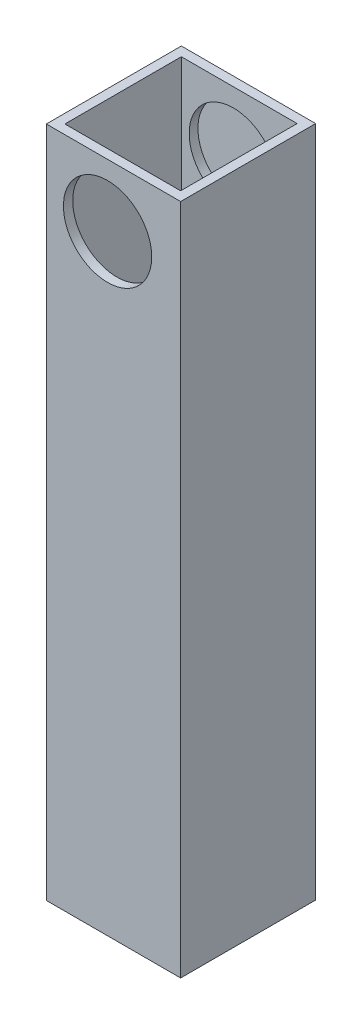
ISO-10303-21;
HEADER;
FILE_DESCRIPTION(('STEP AP214'),'2;1');
FILE_NAME('part.step','',(''),(''),'','','');
FILE_SCHEMA(('AUTOMOTIVE_DESIGN { 1 0 10303 214 1 1 1 1 }'));
ENDSEC;
DATA;
#1=APPLICATION_CONTEXT('core data for automotive mechanical design processes');
#2=APPLICATION_PROTOCOL_DEFINITION('international standard','automotive_design',2000,#1);
#3=PRODUCT_CONTEXT('',#1,'mechanical');
#4=PRODUCT('Part','Part','',(#3));
#5=PRODUCT_RELATED_PRODUCT_CATEGORY('part','',(#4));
#6=PRODUCT_DEFINITION_FORMATION('','',#4);
#7=PRODUCT_DEFINITION_CONTEXT('part definition',#1,'design');
#8=PRODUCT_DEFINITION('design','',#6,#7);
#9=PRODUCT_DEFINITION_SHAPE('','',#8);
#10=(LENGTH_UNIT() NAMED_UNIT(*) SI_UNIT(.MILLI.,.METRE.));
#11=(NAMED_UNIT(*) PLANE_ANGLE_UNIT() SI_UNIT($,.RADIAN.));
#12=(NAMED_UNIT(*) SI_UNIT($,.STERADIAN.) SOLID_ANGLE_UNIT());
#13=UNCERTAINTY_MEASURE_WITH_UNIT(LENGTH_MEASURE(1.E-05),#10,'distance_accuracy_value','');
#14=(GEOMETRIC_REPRESENTATION_CONTEXT(3) GLOBAL_UNCERTAINTY_ASSIGNED_CONTEXT((#13)) GLOBAL_UNIT_ASSIGNED_CONTEXT((#10,
#11,#12)) REPRESENTATION_CONTEXT('',''));
#15=CARTESIAN_POINT('',(0.,0.,0.));
#16=DIRECTION('',(0.,0.,1.));
#17=DIRECTION('',(1.,0.,0.));
#18=AXIS2_PLACEMENT_3D('',#15,#16,#17);
#19=CARTESIAN_POINT('',(0.,127.,0.));
#20=DIRECTION('',(0.,-1.,0.));
#21=DIRECTION('',(0.,0.,-1.));
#22=AXIS2_PLACEMENT_3D('',#19,#20,#21);
#23=PLANE('',#22);
#24=DIRECTION('',(0.,0.,1.));
#25=VECTOR('',#24,1.);
#26=CARTESIAN_POINT('',(0.,127.,25.5038117979981));
#27=LINE('',#26,#25);
#28=CARTESIAN_POINT('',(0.,127.,0.));
#29=VERTEX_POINT('',#28);
#30=CARTESIAN_POINT('',(0.,127.,25.5038117979981));
#31=VERTEX_POINT('',#30);
#32=EDGE_CURVE('E144',#29,#31,#27,.T.);
#33=ORIENTED_EDGE('',*,*,#32,.T.);
#34=DIRECTION('',(1.,0.,0.));
#35=VECTOR('',#34,1.);
#36=CARTESIAN_POINT('',(25.3664243428942,127.,25.5038117979981));
#37=LINE('',#36,#35);
#38=CARTESIAN_POINT('',(25.3664243428942,127.,25.5038117979981));
#39=VERTEX_POINT('',#38);
#40=EDGE_CURVE('E147',#31,#39,#37,.T.);
#41=ORIENTED_EDGE('',*,*,#40,.T.);
#42=DIRECTION('',(0.,0.,-1.));
#43=VECTOR('',#42,1.);
#44=CARTESIAN_POINT('',(25.3664243428942,127.,0.));
#45=LINE('',#44,#43);
#46=CARTESIAN_POINT('',(25.3664243428942,127.,0.));
#47=VERTEX_POINT('',#46);
#48=EDGE_CURVE('E150',#39,#47,#45,.T.);
#49=ORIENTED_EDGE('',*,*,#48,.T.);
#50=DIRECTION('',(-1.,0.,0.));
#51=VECTOR('',#50,1.);
#52=CARTESIAN_POINT('',(0.,127.,0.));
#53=LINE('',#52,#51);
#54=EDGE_CURVE('E152',#47,#29,#53,.T.);
#55=ORIENTED_EDGE('',*,*,#54,.T.);
#56=EDGE_LOOP('',(#33,#41,#49,#55));
#57=FACE_BOUND('',#56,.T.);
#58=DIRECTION('',(1.,0.,0.));
#59=VECTOR('',#58,1.);
#60=CARTESIAN_POINT('',(1.7526,127.,1.7526));
#61=LINE('',#60,#59);
#62=CARTESIAN_POINT('',(1.7526,127.,1.7526));
#63=VERTEX_POINT('',#62);
#64=CARTESIAN_POINT('',(23.6138243428942,127.,1.7526));
#65=VERTEX_POINT('',#64);
#66=EDGE_CURVE('E50',#63,#65,#61,.T.);
#67=ORIENTED_EDGE('',*,*,#66,.T.);
#68=DIRECTION('',(0.,0.,-1.));
#69=VECTOR('',#68,1.);
#70=CARTESIAN_POINT('',(23.6138243428942,127.,23.751211797998));
#71=LINE('',#70,#69);
#72=CARTESIAN_POINT('',(23.6138243428942,127.,23.751211797998));
#73=VERTEX_POINT('',#72);
#74=EDGE_CURVE('E116',#73,#65,#71,.T.);
#75=ORIENTED_EDGE('',*,*,#74,.F.);
#76=DIRECTION('',(1.,0.,0.));
#77=VECTOR('',#76,1.);
#78=CARTESIAN_POINT('',(1.7526,127.,23.751211797998));
#79=LINE('',#78,#77);
#80=CARTESIAN_POINT('',(1.7526,127.,23.751211797998));
#81=VERTEX_POINT('',#80);
#82=EDGE_CURVE('E128',#81,#73,#79,.T.);
#83=ORIENTED_EDGE('',*,*,#82,.F.);
#84=DIRECTION('',(0.,0.,-1.));
#85=VECTOR('',#84,1.);
#86=CARTESIAN_POINT('',(1.7526,127.,23.751211797998));
#87=LINE('',#86,#85);
#88=EDGE_CURVE('E110',#81,#63,#87,.T.);
#89=ORIENTED_EDGE('',*,*,#88,.T.);
#90=EDGE_LOOP('',(#67,#75,#83,#89));
#91=FACE_BOUND('',#90,.T.);
#92=ADVANCED_FACE('F33',(#57,#91),#23,.F.);
#93=CARTESIAN_POINT('',(0.,0.,0.));
#94=DIRECTION('',(0.,-1.,0.));
#95=DIRECTION('',(0.,0.,-1.));
#96=AXIS2_PLACEMENT_3D('',#93,#94,#95);
#97=PLANE('',#96);
#98=DIRECTION('',(0.,0.,1.));
#99=VECTOR('',#98,1.);
#100=CARTESIAN_POINT('',(0.,0.,25.5038117979981));
#101=LINE('',#100,#99);
#102=CARTESIAN_POINT('',(0.,0.,0.));
#103=VERTEX_POINT('',#102);
#104=CARTESIAN_POINT('',(0.,0.,25.5038117979981));
#105=VERTEX_POINT('',#104);
#106=EDGE_CURVE('E140',#103,#105,#101,.T.);
#107=ORIENTED_EDGE('',*,*,#106,.F.);
#108=DIRECTION('',(-1.,0.,0.));
#109=VECTOR('',#108,1.);
#110=CARTESIAN_POINT('',(0.,0.,0.));
#111=LINE('',#110,#109);
#112=CARTESIAN_POINT('',(25.3664243428942,0.,0.));
#113=VERTEX_POINT('',#112);
#114=EDGE_CURVE('E148',#113,#103,#111,.T.);
#115=ORIENTED_EDGE('',*,*,#114,.F.);
#116=DIRECTION('',(0.,0.,-1.));
#117=VECTOR('',#116,1.);
#118=CARTESIAN_POINT('',(25.3664243428942,0.,0.));
#119=LINE('',#118,#117);
#120=CARTESIAN_POINT('',(25.3664243428942,0.,25.5038117979981));
#121=VERTEX_POINT('',#120);
#122=EDGE_CURVE('E159',#121,#113,#119,.T.);
#123=ORIENTED_EDGE('',*,*,#122,.F.);
#124=DIRECTION('',(1.,0.,0.));
#125=VECTOR('',#124,1.);
#126=CARTESIAN_POINT('',(25.3664243428942,0.,25.5038117979981));
#127=LINE('',#126,#125);
#128=EDGE_CURVE('E157',#105,#121,#127,.T.);
#129=ORIENTED_EDGE('',*,*,#128,.F.);
#130=EDGE_LOOP('',(#107,#115,#123,#129));
#131=FACE_BOUND('',#130,.T.);
#132=DIRECTION('',(0.,0.,-1.));
#133=VECTOR('',#132,1.);
#134=CARTESIAN_POINT('',(23.6138243428942,0.,23.751211797998));
#135=LINE('',#134,#133);
#136=CARTESIAN_POINT('',(23.6138243428942,0.,23.751211797998));
#137=VERTEX_POINT('',#136);
#138=CARTESIAN_POINT('',(23.6138243428942,0.,1.7526));
#139=VERTEX_POINT('',#138);
#140=EDGE_CURVE('E109',#137,#139,#135,.T.);
#141=ORIENTED_EDGE('',*,*,#140,.T.);
#142=DIRECTION('',(1.,0.,0.));
#143=VECTOR('',#142,1.);
#144=CARTESIAN_POINT('',(1.7526,0.,1.7526));
#145=LINE('',#144,#143);
#146=CARTESIAN_POINT('',(1.7526,0.,1.7526));
#147=VERTEX_POINT('',#146);
#148=EDGE_CURVE('E99',#147,#139,#145,.T.);
#149=ORIENTED_EDGE('',*,*,#148,.F.);
#150=DIRECTION('',(0.,0.,-1.));
#151=VECTOR('',#150,1.);
#152=CARTESIAN_POINT('',(1.7526,0.,23.751211797998));
#153=LINE('',#152,#151);
#154=CARTESIAN_POINT('',(1.7526,0.,23.751211797998));
#155=VERTEX_POINT('',#154);
#156=EDGE_CURVE('E122',#155,#147,#153,.T.);
#157=ORIENTED_EDGE('',*,*,#156,.F.);
#158=DIRECTION('',(1.,0.,0.));
#159=VECTOR('',#158,1.);
#160=CARTESIAN_POINT('',(1.7526,0.,23.751211797998));
#161=LINE('',#160,#159);
#162=EDGE_CURVE('E58',#155,#137,#161,.T.);
#163=ORIENTED_EDGE('',*,*,#162,.T.);
#164=EDGE_LOOP('',(#141,#149,#157,#163));
#165=FACE_BOUND('',#164,.T.);
#166=ADVANCED_FACE('F120',(#131,#165),#97,.T.);
#167=CARTESIAN_POINT('',(0.,127.,25.5038117979981));
#168=DIRECTION('',(1.,0.,0.));
#169=DIRECTION('',(0.,0.,-1.));
#170=AXIS2_PLACEMENT_3D('',#167,#168,#169);
#171=PLANE('',#170);
#172=ORIENTED_EDGE('',*,*,#106,.T.);
#173=DIRECTION('',(0.,-1.,0.));
#174=VECTOR('',#173,1.);
#175=CARTESIAN_POINT('',(0.,127.,25.5038117979981));
#176=LINE('',#175,#174);
#177=EDGE_CURVE('E11',#31,#105,#176,.T.);
#178=ORIENTED_EDGE('',*,*,#177,.F.);
#179=ORIENTED_EDGE('',*,*,#32,.F.);
#180=DIRECTION('',(0.,-1.,0.));
#181=VECTOR('',#180,1.);
#182=CARTESIAN_POINT('',(0.,127.,0.));
#183=LINE('',#182,#181);
#184=EDGE_CURVE('E154',#29,#103,#183,.T.);
#185=ORIENTED_EDGE('',*,*,#184,.T.);
#186=EDGE_LOOP('',(#172,#178,#179,#185));
#187=FACE_BOUND('',#186,.T.);
#188=ADVANCED_FACE('F35',(#187),#171,.F.);
#189=CARTESIAN_POINT('',(25.3664243428942,127.,25.5038117979981));
#190=DIRECTION('',(0.,0.,-1.));
#191=DIRECTION('',(-1.,0.,0.));
#192=AXIS2_PLACEMENT_3D('',#189,#190,#191);
#193=PLANE('',#192);
#194=CARTESIAN_POINT('',(11.5686081985018,115.201083312627,25.5038117979981));
#195=DIRECTION('',(0.,0.,1.));
#196=DIRECTION('',(1.,0.,0.));
#197=AXIS2_PLACEMENT_3D('',#194,#195,#196);
#198=CIRCLE('',#197,8.33894143613218);
#199=CARTESIAN_POINT('',(19.907549634634,115.201083312627,25.5038117979981));
#200=VERTEX_POINT('',#199);
#201=EDGE_CURVE('E141',#200,#200,#198,.T.);
#202=ORIENTED_EDGE('',*,*,#201,.F.);
#203=EDGE_LOOP('',(#202));
#204=FACE_BOUND('',#203,.T.);
#205=ORIENTED_EDGE('',*,*,#128,.T.);
#206=DIRECTION('',(0.,-1.,0.));
#207=VECTOR('',#206,1.);
#208=CARTESIAN_POINT('',(25.3664243428942,127.,25.5038117979981));
#209=LINE('',#208,#207);
#210=EDGE_CURVE('E42',#39,#121,#209,.T.);
#211=ORIENTED_EDGE('',*,*,#210,.F.);
#212=ORIENTED_EDGE('',*,*,#40,.F.);
#213=ORIENTED_EDGE('',*,*,#177,.T.);
#214=EDGE_LOOP('',(#205,#211,#212,#213));
#215=FACE_BOUND('',#214,.T.);
#216=ADVANCED_FACE('F204',(#204,#215),#193,.F.);
#217=CARTESIAN_POINT('',(25.3664243428942,127.,0.));
#218=DIRECTION('',(-1.,0.,0.));
#219=DIRECTION('',(0.,0.,1.));
#220=AXIS2_PLACEMENT_3D('',#217,#218,#219);
#221=PLANE('',#220);
#222=ORIENTED_EDGE('',*,*,#122,.T.);
#223=DIRECTION('',(0.,-1.,0.));
#224=VECTOR('',#223,1.);
#225=CARTESIAN_POINT('',(25.3664243428942,127.,0.));
#226=LINE('',#225,#224);
#227=EDGE_CURVE('E164',#47,#113,#226,.T.);
#228=ORIENTED_EDGE('',*,*,#227,.F.);
#229=ORIENTED_EDGE('',*,*,#48,.F.);
#230=ORIENTED_EDGE('',*,*,#210,.T.);
#231=EDGE_LOOP('',(#222,#228,#229,#230));
#232=FACE_BOUND('',#231,.T.);
#233=ADVANCED_FACE('F201',(#232),#221,.F.);
#234=CARTESIAN_POINT('',(0.,127.,0.));
#235=DIRECTION('',(0.,0.,1.));
#236=DIRECTION('',(1.,0.,0.));
#237=AXIS2_PLACEMENT_3D('',#234,#235,#236);
#238=PLANE('',#237);
#239=ORIENTED_EDGE('',*,*,#114,.T.);
#240=ORIENTED_EDGE('',*,*,#184,.F.);
#241=ORIENTED_EDGE('',*,*,#54,.F.);
#242=ORIENTED_EDGE('',*,*,#227,.T.);
#243=EDGE_LOOP('',(#239,#240,#241,#242));
#244=FACE_BOUND('',#243,.T.);
#245=ADVANCED_FACE('F189',(#244),#238,.F.);
#246=CARTESIAN_POINT('',(11.5686081985018,115.201083312627,0.103811797998052));
#247=DIRECTION('',(0.,0.,1.));
#248=DIRECTION('',(1.,0.,0.));
#249=AXIS2_PLACEMENT_3D('',#246,#247,#248);
#250=CYLINDRICAL_SURFACE('',#249,8.33894143613218);
#251=CARTESIAN_POINT('',(11.5686081985018,115.201083312627,23.751211797998));
#252=DIRECTION('',(0.,0.,1.));
#253=DIRECTION('',(1.,0.,0.));
#254=AXIS2_PLACEMENT_3D('',#251,#252,#253);
#255=CIRCLE('',#254,8.33894143613218);
#256=CARTESIAN_POINT('',(19.907549634634,115.201083312627,23.751211797998));
#257=VERTEX_POINT('',#256);
#258=EDGE_CURVE('E117',#257,#257,#255,.F.);
#259=ORIENTED_EDGE('',*,*,#258,.T.);
#260=EDGE_LOOP('',(#259));
#261=FACE_BOUND('',#260,.T.);
#262=ORIENTED_EDGE('',*,*,#201,.T.);
#263=EDGE_LOOP('',(#262));
#264=FACE_BOUND('',#263,.T.);
#265=ADVANCED_FACE('F179',(#261,#264),#250,.F.);
#266=CARTESIAN_POINT('',(1.7526,0.,1.7526));
#267=DIRECTION('',(0.,0.,1.));
#268=DIRECTION('',(1.,0.,0.));
#269=AXIS2_PLACEMENT_3D('',#266,#267,#268);
#270=PLANE('',#269);
#271=ORIENTED_EDGE('',*,*,#66,.F.);
#272=DIRECTION('',(0.,1.,0.));
#273=VECTOR('',#272,1.);
#274=CARTESIAN_POINT('',(1.7526,0.,1.7526));
#275=LINE('',#274,#273);
#276=EDGE_CURVE('E105',#147,#63,#275,.T.);
#277=ORIENTED_EDGE('',*,*,#276,.F.);
#278=ORIENTED_EDGE('',*,*,#148,.T.);
#279=DIRECTION('',(0.,1.,0.));
#280=VECTOR('',#279,1.);
#281=CARTESIAN_POINT('',(23.6138243428942,0.,1.7526));
#282=LINE('',#281,#280);
#283=EDGE_CURVE('E103',#139,#65,#282,.T.);
#284=ORIENTED_EDGE('',*,*,#283,.T.);
#285=EDGE_LOOP('',(#271,#277,#278,#284));
#286=FACE_BOUND('',#285,.T.);
#287=CARTESIAN_POINT('',(11.5686081985018,115.201083312627,1.7526));
#288=DIRECTION('',(0.,0.,1.));
#289=DIRECTION('',(1.,0.,0.));
#290=AXIS2_PLACEMENT_3D('',#287,#288,#289);
#291=CIRCLE('',#290,8.33894143613218);
#292=CARTESIAN_POINT('',(19.907549634634,115.201083312627,1.7526));
#293=VERTEX_POINT('',#292);
#294=EDGE_CURVE('E37',#293,#293,#291,.F.);
#295=ORIENTED_EDGE('',*,*,#294,.T.);
#296=EDGE_LOOP('',(#295));
#297=FACE_BOUND('',#296,.T.);
#298=ADVANCED_FACE('F101',(#286,#297),#270,.T.);
#299=CARTESIAN_POINT('',(1.7526,0.,23.751211797998));
#300=DIRECTION('',(0.,0.,1.));
#301=DIRECTION('',(1.,0.,0.));
#302=AXIS2_PLACEMENT_3D('',#299,#300,#301);
#303=PLANE('',#302);
#304=ORIENTED_EDGE('',*,*,#82,.T.);
#305=DIRECTION('',(0.,1.,0.));
#306=VECTOR('',#305,1.);
#307=CARTESIAN_POINT('',(23.6138243428942,0.,23.751211797998));
#308=LINE('',#307,#306);
#309=EDGE_CURVE('E118',#137,#73,#308,.T.);
#310=ORIENTED_EDGE('',*,*,#309,.F.);
#311=ORIENTED_EDGE('',*,*,#162,.F.);
#312=DIRECTION('',(0.,1.,0.));
#313=VECTOR('',#312,1.);
#314=CARTESIAN_POINT('',(1.7526,0.,23.751211797998));
#315=LINE('',#314,#313);
#316=EDGE_CURVE('E134',#155,#81,#315,.T.);
#317=ORIENTED_EDGE('',*,*,#316,.T.);
#318=EDGE_LOOP('',(#304,#310,#311,#317));
#319=FACE_BOUND('',#318,.T.);
#320=ORIENTED_EDGE('',*,*,#258,.F.);
#321=EDGE_LOOP('',(#320));
#322=FACE_BOUND('',#321,.T.);
#323=ADVANCED_FACE('F253',(#319,#322),#303,.F.);
#324=CARTESIAN_POINT('',(23.6138243428942,0.,23.751211797998));
#325=DIRECTION('',(1.,0.,0.));
#326=DIRECTION('',(0.,0.,-1.));
#327=AXIS2_PLACEMENT_3D('',#324,#325,#326);
#328=PLANE('',#327);
#329=ORIENTED_EDGE('',*,*,#74,.T.);
#330=ORIENTED_EDGE('',*,*,#283,.F.);
#331=ORIENTED_EDGE('',*,*,#140,.F.);
#332=ORIENTED_EDGE('',*,*,#309,.T.);
#333=EDGE_LOOP('',(#329,#330,#331,#332));
#334=FACE_BOUND('',#333,.T.);
#335=ADVANCED_FACE('F114',(#334),#328,.F.);
#336=CARTESIAN_POINT('',(1.7526,0.,23.751211797998));
#337=DIRECTION('',(1.,0.,0.));
#338=DIRECTION('',(0.,0.,-1.));
#339=AXIS2_PLACEMENT_3D('',#336,#337,#338);
#340=PLANE('',#339);
#341=ORIENTED_EDGE('',*,*,#88,.F.);
#342=ORIENTED_EDGE('',*,*,#316,.F.);
#343=ORIENTED_EDGE('',*,*,#156,.T.);
#344=ORIENTED_EDGE('',*,*,#276,.T.);
#345=EDGE_LOOP('',(#341,#342,#343,#344));
#346=FACE_BOUND('',#345,.T.);
#347=ADVANCED_FACE('F183',(#346),#340,.T.);
#348=CARTESIAN_POINT('',(11.5686081985018,115.201083312627,0.103811797998052));
#349=DIRECTION('',(0.,0.,1.));
#350=DIRECTION('',(1.,0.,0.));
#351=AXIS2_PLACEMENT_3D('',#348,#349,#350);
#352=PLANE('',#351);
#353=CARTESIAN_POINT('',(11.5686081985018,115.201083312627,0.103811797998052));
#354=DIRECTION('',(0.,0.,1.));
#355=DIRECTION('',(1.,0.,0.));
#356=AXIS2_PLACEMENT_3D('',#353,#354,#355);
#357=CIRCLE('',#356,8.33894143613218);
#358=CARTESIAN_POINT('',(19.907549634634,115.201083312627,0.103811797998052));
#359=VERTEX_POINT('',#358);
#360=EDGE_CURVE('E137',#359,#359,#357,.T.);
#361=ORIENTED_EDGE('',*,*,#360,.T.);
#362=EDGE_LOOP('',(#361));
#363=FACE_BOUND('',#362,.T.);
#364=ADVANCED_FACE('F176',(#363),#352,.T.);
#365=ORIENTED_EDGE('',*,*,#360,.F.);
#366=EDGE_LOOP('',(#365));
#367=FACE_BOUND('',#366,.T.);
#368=ORIENTED_EDGE('',*,*,#294,.F.);
#369=EDGE_LOOP('',(#368));
#370=FACE_BOUND('',#369,.T.);
#371=ADVANCED_FACE('F174',(#367,#370),#250,.F.);
#372=CLOSED_SHELL('',(#92,#166,#188,#216,#233,#245,#265,#298,#323,#335,#347,#364,#371));
#373=MANIFOLD_SOLID_BREP('B2',#372);
#374=ADVANCED_BREP_SHAPE_REPRESENTATION('',(#18,#373),#14);
#375=SHAPE_DEFINITION_REPRESENTATION(#9,#374);
ENDSEC;
END-ISO-10303-21;
